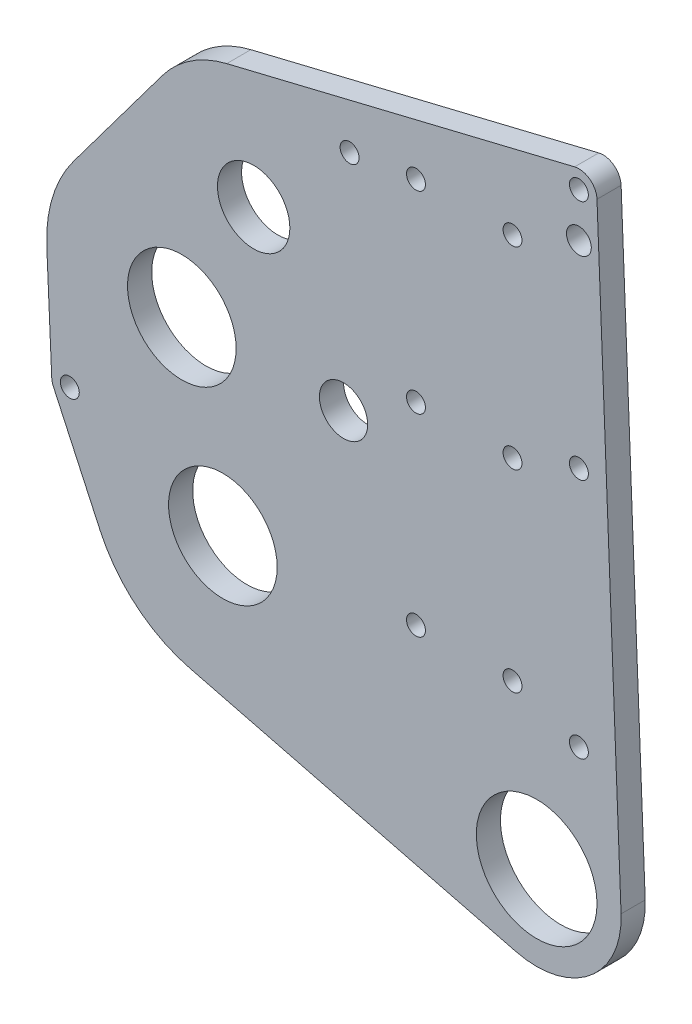
ISO-10303-21;
HEADER;
FILE_DESCRIPTION(('STEP AP214'),'2;1');
FILE_NAME('part.step','',(''),(''),'','','');
FILE_SCHEMA(('AUTOMOTIVE_DESIGN { 1 0 10303 214 1 1 1 1 }'));
ENDSEC;
DATA;
#1=APPLICATION_CONTEXT('core data for automotive mechanical design processes');
#2=APPLICATION_PROTOCOL_DEFINITION('international standard','automotive_design',2000,#1);
#3=PRODUCT_CONTEXT('',#1,'mechanical');
#4=PRODUCT('Part','Part','',(#3));
#5=PRODUCT_RELATED_PRODUCT_CATEGORY('part','',(#4));
#6=PRODUCT_DEFINITION_FORMATION('','',#4);
#7=PRODUCT_DEFINITION_CONTEXT('part definition',#1,'design');
#8=PRODUCT_DEFINITION('design','',#6,#7);
#9=PRODUCT_DEFINITION_SHAPE('','',#8);
#10=(LENGTH_UNIT() NAMED_UNIT(*) SI_UNIT(.MILLI.,.METRE.));
#11=(NAMED_UNIT(*) PLANE_ANGLE_UNIT() SI_UNIT($,.RADIAN.));
#12=(NAMED_UNIT(*) SI_UNIT($,.STERADIAN.) SOLID_ANGLE_UNIT());
#13=UNCERTAINTY_MEASURE_WITH_UNIT(LENGTH_MEASURE(1.E-05),#10,'distance_accuracy_value','');
#14=(GEOMETRIC_REPRESENTATION_CONTEXT(3) GLOBAL_UNCERTAINTY_ASSIGNED_CONTEXT((#13)) GLOBAL_UNIT_ASSIGNED_CONTEXT((#10,
#11,#12)) REPRESENTATION_CONTEXT('',''));
#15=CARTESIAN_POINT('',(0.,0.,0.));
#16=DIRECTION('',(0.,0.,1.));
#17=DIRECTION('',(1.,0.,0.));
#18=AXIS2_PLACEMENT_3D('',#15,#16,#17);
#19=CARTESIAN_POINT('',(-81.4649837073853,-3.60509332241219,6.35));
#20=DIRECTION('',(0.999022259122611,0.0442100189725756,0.));
#21=DIRECTION('',(-0.0442100189725756,0.999022259122611,0.));
#22=AXIS2_PLACEMENT_3D('',#19,#20,#21);
#23=PLANE('',#22);
#24=DIRECTION('',(0.0442100189725756,-0.999022259122611,0.));
#25=VECTOR('',#24,1.);
#26=CARTESIAN_POINT('',(-81.4649837073853,-3.60509332241219,0.));
#27=LINE('',#26,#25);
#28=CARTESIAN_POINT('',(-84.4202315344,63.1752073656032,0.));
#29=VERTEX_POINT('',#28);
#30=CARTESIAN_POINT('',(-83.1225405635379,33.8510361600236,0.));
#31=VERTEX_POINT('',#30);
#32=EDGE_CURVE('E240',#29,#31,#27,.T.);
#33=ORIENTED_EDGE('',*,*,#32,.T.);
#34=DIRECTION('',(0.,0.,-1.));
#35=VECTOR('',#34,1.);
#36=CARTESIAN_POINT('',(-83.1225405635379,33.8510361600236,6.35));
#37=LINE('',#36,#35);
#38=CARTESIAN_POINT('',(-83.1225405635379,33.8510361600236,6.35));
#39=VERTEX_POINT('',#38);
#40=EDGE_CURVE('E11',#39,#31,#37,.T.);
#41=ORIENTED_EDGE('',*,*,#40,.F.);
#42=DIRECTION('',(0.0442100189725756,-0.999022259122611,0.));
#43=VECTOR('',#42,1.);
#44=CARTESIAN_POINT('',(-81.4649837073853,-3.60509332241219,6.35));
#45=LINE('',#44,#43);
#46=CARTESIAN_POINT('',(-84.4202315344,63.1752073656032,6.35));
#47=VERTEX_POINT('',#46);
#48=EDGE_CURVE('E354',#47,#39,#45,.T.);
#49=ORIENTED_EDGE('',*,*,#48,.F.);
#50=DIRECTION('',(0.,0.,-1.));
#51=VECTOR('',#50,1.);
#52=CARTESIAN_POINT('',(-84.4202315344,63.1752073656032,6.35));
#53=LINE('',#52,#51);
#54=EDGE_CURVE('E168',#47,#29,#53,.T.);
#55=ORIENTED_EDGE('',*,*,#54,.T.);
#56=EDGE_LOOP('',(#33,#41,#49,#55));
#57=FACE_BOUND('',#56,.T.);
#58=ADVANCED_FACE('F47',(#57),#23,.F.);
#59=CARTESIAN_POINT('',(-78.3646970544664,34.0615863753805,6.35));
#60=DIRECTION('',(0.,0.,-1.));
#61=DIRECTION('',(-1.,0.,0.));
#62=AXIS2_PLACEMENT_3D('',#59,#60,#61);
#63=CYLINDRICAL_SURFACE('',#62,4.76250000000001);
#64=CARTESIAN_POINT('',(-78.3646970544664,34.0615863753805,0.));
#65=DIRECTION('',(0.,0.,1.));
#66=DIRECTION('',(1.,0.,0.));
#67=AXIS2_PLACEMENT_3D('',#64,#65,#66);
#68=CIRCLE('',#67,4.76250000000001);
#69=CARTESIAN_POINT('',(-82.6886710093196,32.0654261894858,0.));
#70=VERTEX_POINT('',#69);
#71=EDGE_CURVE('E244',#31,#70,#68,.T.);
#72=ORIENTED_EDGE('',*,*,#71,.T.);
#73=DIRECTION('',(0.,0.,-1.));
#74=VECTOR('',#73,1.);
#75=CARTESIAN_POINT('',(-82.6886710093196,32.0654261894858,6.35));
#76=LINE('',#75,#74);
#77=CARTESIAN_POINT('',(-82.6886710093196,32.0654261894858,6.35));
#78=VERTEX_POINT('',#77);
#79=EDGE_CURVE('E57',#78,#70,#76,.T.);
#80=ORIENTED_EDGE('',*,*,#79,.F.);
#81=CARTESIAN_POINT('',(-78.3646970544664,34.0615863753805,6.35));
#82=DIRECTION('',(0.,0.,1.));
#83=DIRECTION('',(1.,0.,0.));
#84=AXIS2_PLACEMENT_3D('',#81,#82,#83);
#85=CIRCLE('',#84,4.76250000000001);
#86=EDGE_CURVE('E120',#39,#78,#85,.T.);
#87=ORIENTED_EDGE('',*,*,#86,.F.);
#88=ORIENTED_EDGE('',*,*,#40,.T.);
#89=EDGE_LOOP('',(#72,#80,#87,#88));
#90=FACE_BOUND('',#89,.T.);
#91=ADVANCED_FACE('F369',(#90),#63,.T.);
#92=CARTESIAN_POINT('',(-55.9595694301041,-25.8337042920453,6.35));
#93=DIRECTION('',(0.907921040389125,0.419141246382087,0.));
#94=DIRECTION('',(-0.419141246382087,0.907921040389125,0.));
#95=AXIS2_PLACEMENT_3D('',#92,#93,#94);
#96=PLANE('',#95);
#97=DIRECTION('',(0.419141246382087,-0.907921040389125,0.));
#98=VECTOR('',#97,1.);
#99=CARTESIAN_POINT('',(-55.9595694301041,-25.8337042920453,0.));
#100=LINE('',#99,#98);
#101=CARTESIAN_POINT('',(-70.3856721962373,5.41533727865297,0.));
#102=VERTEX_POINT('',#101);
#103=EDGE_CURVE('E247',#70,#102,#100,.T.);
#104=ORIENTED_EDGE('',*,*,#103,.T.);
#105=DIRECTION('',(0.,0.,-1.));
#106=VECTOR('',#105,1.);
#107=CARTESIAN_POINT('',(-70.3856721962373,5.41533727865297,6.35));
#108=LINE('',#107,#106);
#109=CARTESIAN_POINT('',(-70.3856721962373,5.41533727865297,6.35));
#110=VERTEX_POINT('',#109);
#111=EDGE_CURVE('E302',#110,#102,#108,.T.);
#112=ORIENTED_EDGE('',*,*,#111,.F.);
#113=DIRECTION('',(0.419141246382087,-0.907921040389125,0.));
#114=VECTOR('',#113,1.);
#115=CARTESIAN_POINT('',(-55.9595694301041,-25.8337042920453,6.35));
#116=LINE('',#115,#114);
#117=EDGE_CURVE('E312',#78,#110,#116,.T.);
#118=ORIENTED_EDGE('',*,*,#117,.F.);
#119=ORIENTED_EDGE('',*,*,#79,.T.);
#120=EDGE_LOOP('',(#104,#112,#118,#119));
#121=FACE_BOUND('',#120,.T.);
#122=ADVANCED_FACE('F310',(#121),#96,.F.);
#123=CARTESIAN_POINT('',(-38.1,20.32,6.35));
#124=DIRECTION('',(0.,0.,-1.));
#125=DIRECTION('',(-1.,0.,0.));
#126=AXIS2_PLACEMENT_3D('',#123,#124,#125);
#127=CYLINDRICAL_SURFACE('',#126,35.56);
#128=CARTESIAN_POINT('',(-38.1,20.32,0.));
#129=DIRECTION('',(0.,0.,1.));
#130=DIRECTION('',(1.,0.,0.));
#131=AXIS2_PLACEMENT_3D('',#128,#129,#130);
#132=CIRCLE('',#131,35.56);
#133=CARTESIAN_POINT('',(-46.8094811901803,-14.1569276096043,0.));
#134=VERTEX_POINT('',#133);
#135=EDGE_CURVE('E250',#102,#134,#132,.T.);
#136=ORIENTED_EDGE('',*,*,#135,.T.);
#137=DIRECTION('',(0.,0.,-1.));
#138=VECTOR('',#137,1.);
#139=CARTESIAN_POINT('',(-46.8094811901803,-14.1569276096043,6.35));
#140=LINE('',#139,#138);
#141=CARTESIAN_POINT('',(-46.8094811901803,-14.1569276096043,6.35));
#142=VERTEX_POINT('',#141);
#143=EDGE_CURVE('E298',#142,#134,#140,.T.);
#144=ORIENTED_EDGE('',*,*,#143,.F.);
#145=CARTESIAN_POINT('',(-38.1,20.32,6.35));
#146=DIRECTION('',(0.,0.,1.));
#147=DIRECTION('',(1.,0.,0.));
#148=AXIS2_PLACEMENT_3D('',#145,#146,#147);
#149=CIRCLE('',#148,35.56);
#150=EDGE_CURVE('E331',#110,#142,#149,.T.);
#151=ORIENTED_EDGE('',*,*,#150,.F.);
#152=ORIENTED_EDGE('',*,*,#111,.T.);
#153=EDGE_LOOP('',(#136,#144,#151,#152));
#154=FACE_BOUND('',#153,.T.);
#155=ADVANCED_FACE('F321',(#154),#127,.T.);
#156=CARTESIAN_POINT('',(-6.1697429589074,-24.423243671959,6.35));
#157=DIRECTION('',(0.244923543030941,0.969542396220594,0.));
#158=DIRECTION('',(-0.969542396220594,0.244923543030941,0.));
#159=AXIS2_PLACEMENT_3D('',#156,#157,#158);
#160=PLANE('',#159);
#161=DIRECTION('',(0.969542396220594,-0.244923543030941,0.));
#162=VECTOR('',#161,1.);
#163=CARTESIAN_POINT('',(-6.1697429589074,-24.423243671959,0.));
#164=LINE('',#163,#162);
#165=CARTESIAN_POINT('',(39.0065742561373,-35.8355797560027,0.));
#166=VERTEX_POINT('',#165);
#167=EDGE_CURVE('E253',#134,#166,#164,.T.);
#168=ORIENTED_EDGE('',*,*,#167,.T.);
#169=DIRECTION('',(0.,0.,-1.));
#170=VECTOR('',#169,1.);
#171=CARTESIAN_POINT('',(39.0065742561373,-35.8355797560027,6.35));
#172=LINE('',#171,#170);
#173=CARTESIAN_POINT('',(39.0065742561373,-35.8355797560027,6.35));
#174=VERTEX_POINT('',#173);
#175=EDGE_CURVE('E294',#174,#166,#172,.T.);
#176=ORIENTED_EDGE('',*,*,#175,.F.);
#177=DIRECTION('',(0.969542396220594,-0.244923543030941,0.));
#178=VECTOR('',#177,1.);
#179=CARTESIAN_POINT('',(-6.1697429589074,-24.423243671959,6.35));
#180=LINE('',#179,#178);
#181=EDGE_CURVE('E327',#142,#174,#180,.T.);
#182=ORIENTED_EDGE('',*,*,#181,.F.);
#183=ORIENTED_EDGE('',*,*,#143,.T.);
#184=EDGE_LOOP('',(#168,#176,#182,#183));
#185=FACE_BOUND('',#184,.T.);
#186=ADVANCED_FACE('F325',(#185),#160,.F.);
#187=CARTESIAN_POINT('',(44.45,-14.2875,6.35));
#188=DIRECTION('',(0.,0.,-1.));
#189=DIRECTION('',(-1.,0.,0.));
#190=AXIS2_PLACEMENT_3D('',#187,#188,#189);
#191=CYLINDRICAL_SURFACE('',#190,22.225);
#192=CARTESIAN_POINT('',(44.45,-14.2875,0.));
#193=DIRECTION('',(0.,0.,1.));
#194=DIRECTION('',(1.,0.,0.));
#195=AXIS2_PLACEMENT_3D('',#192,#193,#194);
#196=CIRCLE('',#195,22.225);
#197=CARTESIAN_POINT('',(66.6575154334442,-13.4060901785567,0.));
#198=VERTEX_POINT('',#197);
#199=EDGE_CURVE('E256',#166,#198,#196,.T.);
#200=ORIENTED_EDGE('',*,*,#199,.T.);
#201=DIRECTION('',(0.,0.,-1.));
#202=VECTOR('',#201,1.);
#203=CARTESIAN_POINT('',(66.6575154334442,-13.4060901785567,6.35));
#204=LINE('',#203,#202);
#205=CARTESIAN_POINT('',(66.6575154334442,-13.4060901785567,6.35));
#206=VERTEX_POINT('',#205);
#207=EDGE_CURVE('E291',#206,#198,#204,.T.);
#208=ORIENTED_EDGE('',*,*,#207,.F.);
#209=CARTESIAN_POINT('',(44.45,-14.2875,6.35));
#210=DIRECTION('',(0.,0.,1.));
#211=DIRECTION('',(1.,0.,0.));
#212=AXIS2_PLACEMENT_3D('',#209,#210,#211);
#213=CIRCLE('',#212,22.225);
#214=EDGE_CURVE('E330',#174,#206,#213,.T.);
#215=ORIENTED_EDGE('',*,*,#214,.F.);
#216=ORIENTED_EDGE('',*,*,#175,.T.);
#217=EDGE_LOOP('',(#200,#208,#215,#216));
#218=FACE_BOUND('',#217,.T.);
#219=ADVANCED_FACE('F650',(#218),#191,.T.);
#220=CARTESIAN_POINT('',(66.0214298426699,2.62037132715079,6.35));
#221=DIRECTION('',(0.999213292843385,0.0396584846543646,0.));
#222=DIRECTION('',(-0.0396584846543647,0.999213292843385,0.));
#223=AXIS2_PLACEMENT_3D('',#220,#221,#222);
#224=PLANE('',#223);
#225=DIRECTION('',(0.0396584846543647,-0.999213292843385,0.));
#226=VECTOR('',#225,1.);
#227=CARTESIAN_POINT('',(66.0214298426699,2.62037132715079,0.));
#228=LINE('',#227,#226);
#229=CARTESIAN_POINT('',(60.3212533071744,146.238873533191,0.));
#230=VERTEX_POINT('',#229);
#231=EDGE_CURVE('E260',#230,#198,#228,.T.);
#232=ORIENTED_EDGE('',*,*,#231,.F.);
#233=DIRECTION('',(0.,0.,-1.));
#234=VECTOR('',#233,1.);
#235=CARTESIAN_POINT('',(60.3212533071744,146.238873533191,6.35));
#236=LINE('',#235,#234);
#237=CARTESIAN_POINT('',(60.3212533071744,146.238873533191,6.35));
#238=VERTEX_POINT('',#237);
#239=EDGE_CURVE('E288',#238,#230,#236,.T.);
#240=ORIENTED_EDGE('',*,*,#239,.F.);
#241=DIRECTION('',(0.0396584846543647,-0.999213292843385,0.));
#242=VECTOR('',#241,1.);
#243=CARTESIAN_POINT('',(66.0214298426699,2.62037132715079,6.35));
#244=LINE('',#243,#242);
#245=EDGE_CURVE('E335',#238,#206,#244,.T.);
#246=ORIENTED_EDGE('',*,*,#245,.T.);
#247=ORIENTED_EDGE('',*,*,#207,.T.);
#248=EDGE_LOOP('',(#232,#240,#246,#247));
#249=FACE_BOUND('',#248,.T.);
#250=ADVANCED_FACE('F640',(#249),#224,.T.);
#251=CARTESIAN_POINT('',(55.5625000000077,146.050000000024,6.35));
#252=DIRECTION('',(0.,0.,-1.));
#253=DIRECTION('',(-1.,0.,0.));
#254=AXIS2_PLACEMENT_3D('',#251,#252,#253);
#255=CYLINDRICAL_SURFACE('',#254,4.76250000000002);
#256=CARTESIAN_POINT('',(55.5625000000077,146.050000000024,0.));
#257=DIRECTION('',(0.,0.,1.));
#258=DIRECTION('',(1.,0.,0.));
#259=AXIS2_PLACEMENT_3D('',#256,#257,#258);
#260=CIRCLE('',#259,4.76250000000002);
#261=CARTESIAN_POINT('',(54.4379586815956,150.677830277075,0.));
#262=VERTEX_POINT('',#261);
#263=EDGE_CURVE('E264',#230,#262,#260,.T.);
#264=ORIENTED_EDGE('',*,*,#263,.T.);
#265=DIRECTION('',(0.,0.,-1.));
#266=VECTOR('',#265,1.);
#267=CARTESIAN_POINT('',(54.4379586815956,150.677830277075,6.35));
#268=LINE('',#267,#266);
#269=CARTESIAN_POINT('',(54.4379586815956,150.677830277075,6.35));
#270=VERTEX_POINT('',#269);
#271=EDGE_CURVE('E285',#270,#262,#268,.T.);
#272=ORIENTED_EDGE('',*,*,#271,.F.);
#273=CARTESIAN_POINT('',(55.5625000000077,146.050000000024,6.35));
#274=DIRECTION('',(0.,0.,1.));
#275=DIRECTION('',(1.,0.,0.));
#276=AXIS2_PLACEMENT_3D('',#273,#274,#275);
#277=CIRCLE('',#276,4.76250000000002);
#278=EDGE_CURVE('E343',#238,#270,#277,.T.);
#279=ORIENTED_EDGE('',*,*,#278,.F.);
#280=ORIENTED_EDGE('',*,*,#239,.T.);
#281=EDGE_LOOP('',(#264,#272,#279,#280));
#282=FACE_BOUND('',#281,.T.);
#283=ADVANCED_FACE('F631',(#282),#255,.T.);
#284=CARTESIAN_POINT('',(-31.5374465878124,129.786205086727,6.35));
#285=DIRECTION('',(-0.23612416134638,0.971722892818971,0.));
#286=DIRECTION('',(-0.971722892818971,-0.23612416134638,0.));
#287=AXIS2_PLACEMENT_3D('',#284,#285,#286);
#288=PLANE('',#287);
#289=DIRECTION('',(0.971722892818971,0.23612416134638,0.));
#290=VECTOR('',#289,1.);
#291=CARTESIAN_POINT('',(-31.5374465878124,129.786205086727,0.));
#292=LINE('',#291,#290);
#293=CARTESIAN_POINT('',(-37.0837247711685,128.43848518189,0.));
#294=VERTEX_POINT('',#293);
#295=EDGE_CURVE('E268',#294,#262,#292,.T.);
#296=ORIENTED_EDGE('',*,*,#295,.F.);
#297=DIRECTION('',(0.,0.,-1.));
#298=VECTOR('',#297,1.);
#299=CARTESIAN_POINT('',(-37.0837247711685,128.43848518189,6.35));
#300=LINE('',#299,#298);
#301=CARTESIAN_POINT('',(-37.0837247711685,128.43848518189,6.35));
#302=VERTEX_POINT('',#301);
#303=EDGE_CURVE('E161',#302,#294,#300,.T.);
#304=ORIENTED_EDGE('',*,*,#303,.F.);
#305=DIRECTION('',(0.971722892818971,0.23612416134638,0.));
#306=VECTOR('',#305,1.);
#307=CARTESIAN_POINT('',(-31.5374465878124,129.786205086727,6.35));
#308=LINE('',#307,#306);
#309=EDGE_CURVE('E152',#302,#270,#308,.T.);
#310=ORIENTED_EDGE('',*,*,#309,.T.);
#311=ORIENTED_EDGE('',*,*,#271,.T.);
#312=EDGE_LOOP('',(#296,#304,#310,#311));
#313=FACE_BOUND('',#312,.T.);
#314=ADVANCED_FACE('F348',(#313),#288,.T.);
#315=CARTESIAN_POINT('',(-29.999999944,99.286798451737,6.35));
#316=DIRECTION('',(0.,0.,-1.));
#317=DIRECTION('',(-1.,0.,0.));
#318=AXIS2_PLACEMENT_3D('',#315,#316,#317);
#319=CYLINDRICAL_SURFACE('',#318,29.999999944);
#320=CARTESIAN_POINT('',(-29.999999944,99.286798451737,0.));
#321=DIRECTION('',(0.,0.,1.));
#322=DIRECTION('',(1.,0.,0.));
#323=AXIS2_PLACEMENT_3D('',#320,#321,#322);
#324=CIRCLE('',#323,29.999999944);
#325=CARTESIAN_POINT('',(-54.0220083124324,117.257416431845,0.));
#326=VERTEX_POINT('',#325);
#327=EDGE_CURVE('E159',#294,#326,#324,.T.);
#328=ORIENTED_EDGE('',*,*,#327,.T.);
#329=DIRECTION('',(0.,0.,-1.));
#330=VECTOR('',#329,1.);
#331=CARTESIAN_POINT('',(-54.0220083124324,117.257416431845,6.35));
#332=LINE('',#331,#330);
#333=CARTESIAN_POINT('',(-54.0220083124324,117.257416431845,6.35));
#334=VERTEX_POINT('',#333);
#335=EDGE_CURVE('E156',#334,#326,#332,.T.);
#336=ORIENTED_EDGE('',*,*,#335,.F.);
#337=CARTESIAN_POINT('',(-29.999999944,99.286798451737,6.35));
#338=DIRECTION('',(0.,0.,1.));
#339=DIRECTION('',(1.,0.,0.));
#340=AXIS2_PLACEMENT_3D('',#337,#338,#339);
#341=CIRCLE('',#340,29.999999944);
#342=EDGE_CURVE('E146',#302,#334,#341,.T.);
#343=ORIENTED_EDGE('',*,*,#342,.F.);
#344=ORIENTED_EDGE('',*,*,#303,.T.);
#345=EDGE_LOOP('',(#328,#336,#343,#344));
#346=FACE_BOUND('',#345,.T.);
#347=ADVANCED_FACE('F157',(#346),#319,.T.);
#348=CARTESIAN_POINT('',(-90.8807396002924,67.9869488036928,6.35));
#349=DIRECTION('',(0.800733613775781,-0.599020600455091,0.));
#350=DIRECTION('',(0.599020600455091,0.800733613775781,0.));
#351=AXIS2_PLACEMENT_3D('',#348,#349,#350);
#352=PLANE('',#351);
#353=DIRECTION('',(-0.599020600455091,-0.800733613775781,0.));
#354=VECTOR('',#353,1.);
#355=CARTESIAN_POINT('',(-90.8807396002924,67.9869488036928,0.));
#356=LINE('',#355,#354);
#357=CARTESIAN_POINT('',(-77.3690873058668,86.048488192451,0.));
#358=VERTEX_POINT('',#357);
#359=EDGE_CURVE('E106',#326,#358,#356,.T.);
#360=ORIENTED_EDGE('',*,*,#359,.T.);
#361=DIRECTION('',(0.,0.,-1.));
#362=VECTOR('',#361,1.);
#363=CARTESIAN_POINT('',(-77.3690873058668,86.048488192451,6.35));
#364=LINE('',#363,#362);
#365=CARTESIAN_POINT('',(-77.3690873058668,86.048488192451,6.35));
#366=VERTEX_POINT('',#365);
#367=EDGE_CURVE('E162',#366,#358,#364,.T.);
#368=ORIENTED_EDGE('',*,*,#367,.F.);
#369=DIRECTION('',(-0.599020600455091,-0.800733613775781,0.));
#370=VECTOR('',#369,1.);
#371=CARTESIAN_POINT('',(-90.8807396002924,67.9869488036928,6.35));
#372=LINE('',#371,#370);
#373=EDGE_CURVE('E150',#334,#366,#372,.T.);
#374=ORIENTED_EDGE('',*,*,#373,.F.);
#375=ORIENTED_EDGE('',*,*,#335,.T.);
#376=EDGE_LOOP('',(#360,#368,#374,#375));
#377=FACE_BOUND('',#376,.T.);
#378=ADVANCED_FACE('F164',(#377),#352,.F.);
#379=CARTESIAN_POINT('',(44.45,-14.2875,6.35));
#380=DIRECTION('',(0.,0.,-1.));
#381=DIRECTION('',(-1.,0.,0.));
#382=AXIS2_PLACEMENT_3D('',#379,#380,#381);
#383=CYLINDRICAL_SURFACE('',#382,15.875);
#384=CARTESIAN_POINT('',(44.45,-14.2875,6.35));
#385=DIRECTION('',(0.,0.,1.));
#386=DIRECTION('',(1.,0.,0.));
#387=AXIS2_PLACEMENT_3D('',#384,#385,#386);
#388=CIRCLE('',#387,15.875);
#389=CARTESIAN_POINT('',(60.325,-14.2875,6.35));
#390=VERTEX_POINT('',#389);
#391=EDGE_CURVE('E764',#390,#390,#388,.T.);
#392=ORIENTED_EDGE('',*,*,#391,.T.);
#393=EDGE_LOOP('',(#392));
#394=FACE_BOUND('',#393,.T.);
#395=CARTESIAN_POINT('',(44.45,-14.2875,0.));
#396=DIRECTION('',(0.,0.,1.));
#397=DIRECTION('',(1.,0.,0.));
#398=AXIS2_PLACEMENT_3D('',#395,#396,#397);
#399=CIRCLE('',#398,15.875);
#400=CARTESIAN_POINT('',(60.325,-14.2875,0.));
#401=VERTEX_POINT('',#400);
#402=EDGE_CURVE('E236',#401,#401,#399,.T.);
#403=ORIENTED_EDGE('',*,*,#402,.F.);
#404=EDGE_LOOP('',(#403));
#405=FACE_BOUND('',#404,.T.);
#406=ADVANCED_FACE('F377',(#394,#405),#383,.F.);
#407=CARTESIAN_POINT('',(-29.999999944,99.286798451737,6.35));
#408=DIRECTION('',(0.,0.,-1.));
#409=DIRECTION('',(-1.,0.,0.));
#410=AXIS2_PLACEMENT_3D('',#407,#408,#409);
#411=CYLINDRICAL_SURFACE('',#410,9.52500000000001);
#412=CARTESIAN_POINT('',(-29.999999944,99.286798451737,6.35));
#413=DIRECTION('',(0.,0.,1.));
#414=DIRECTION('',(1.,0.,0.));
#415=AXIS2_PLACEMENT_3D('',#412,#413,#414);
#416=CIRCLE('',#415,9.52500000000001);
#417=CARTESIAN_POINT('',(-20.474999944,99.286798451737,6.35));
#418=VERTEX_POINT('',#417);
#419=EDGE_CURVE('E760',#418,#418,#416,.T.);
#420=ORIENTED_EDGE('',*,*,#419,.T.);
#421=EDGE_LOOP('',(#420));
#422=FACE_BOUND('',#421,.T.);
#423=CARTESIAN_POINT('',(-29.999999944,99.286798451737,0.));
#424=DIRECTION('',(0.,0.,1.));
#425=DIRECTION('',(1.,0.,0.));
#426=AXIS2_PLACEMENT_3D('',#423,#424,#425);
#427=CIRCLE('',#426,9.52500000000001);
#428=CARTESIAN_POINT('',(-20.474999944,99.286798451737,0.));
#429=VERTEX_POINT('',#428);
#430=EDGE_CURVE('E232',#429,#429,#427,.T.);
#431=ORIENTED_EDGE('',*,*,#430,.F.);
#432=EDGE_LOOP('',(#431));
#433=FACE_BOUND('',#432,.T.);
#434=ADVANCED_FACE('F380',(#422,#433),#411,.F.);
#435=CARTESIAN_POINT('',(12.7,127.,6.35));
#436=DIRECTION('',(0.,0.,-1.));
#437=DIRECTION('',(-1.,0.,0.));
#438=AXIS2_PLACEMENT_3D('',#435,#436,#437);
#439=CYLINDRICAL_SURFACE('',#438,2.48920000000001);
#440=CARTESIAN_POINT('',(12.7,127.,6.35));
#441=DIRECTION('',(0.,0.,1.));
#442=DIRECTION('',(1.,0.,0.));
#443=AXIS2_PLACEMENT_3D('',#440,#441,#442);
#444=CIRCLE('',#443,2.48920000000001);
#445=CARTESIAN_POINT('',(15.1892,127.,6.35));
#446=VERTEX_POINT('',#445);
#447=EDGE_CURVE('E756',#446,#446,#444,.T.);
#448=ORIENTED_EDGE('',*,*,#447,.T.);
#449=EDGE_LOOP('',(#448));
#450=FACE_BOUND('',#449,.T.);
#451=CARTESIAN_POINT('',(12.7,127.,0.));
#452=DIRECTION('',(0.,0.,1.));
#453=DIRECTION('',(1.,0.,0.));
#454=AXIS2_PLACEMENT_3D('',#451,#452,#453);
#455=CIRCLE('',#454,2.48920000000001);
#456=CARTESIAN_POINT('',(15.1892,127.,0.));
#457=VERTEX_POINT('',#456);
#458=EDGE_CURVE('E228',#457,#457,#455,.T.);
#459=ORIENTED_EDGE('',*,*,#458,.F.);
#460=EDGE_LOOP('',(#459));
#461=FACE_BOUND('',#460,.T.);
#462=ADVANCED_FACE('F384',(#450,#461),#439,.F.);
#463=CARTESIAN_POINT('',(38.1,127.,6.35));
#464=DIRECTION('',(0.,0.,-1.));
#465=DIRECTION('',(-1.,0.,0.));
#466=AXIS2_PLACEMENT_3D('',#463,#464,#465);
#467=CYLINDRICAL_SURFACE('',#466,2.48919999999997);
#468=CARTESIAN_POINT('',(38.1,127.,6.35));
#469=DIRECTION('',(0.,0.,1.));
#470=DIRECTION('',(1.,0.,0.));
#471=AXIS2_PLACEMENT_3D('',#468,#469,#470);
#472=CIRCLE('',#471,2.48919999999997);
#473=CARTESIAN_POINT('',(40.5892,127.,6.35));
#474=VERTEX_POINT('',#473);
#475=EDGE_CURVE('E752',#474,#474,#472,.T.);
#476=ORIENTED_EDGE('',*,*,#475,.T.);
#477=EDGE_LOOP('',(#476));
#478=FACE_BOUND('',#477,.T.);
#479=CARTESIAN_POINT('',(38.1,127.,0.));
#480=DIRECTION('',(0.,0.,1.));
#481=DIRECTION('',(1.,0.,0.));
#482=AXIS2_PLACEMENT_3D('',#479,#480,#481);
#483=CIRCLE('',#482,2.48919999999997);
#484=CARTESIAN_POINT('',(40.5892,127.,0.));
#485=VERTEX_POINT('',#484);
#486=EDGE_CURVE('E224',#485,#485,#483,.T.);
#487=ORIENTED_EDGE('',*,*,#486,.F.);
#488=EDGE_LOOP('',(#487));
#489=FACE_BOUND('',#488,.T.);
#490=ADVANCED_FACE('F388',(#478,#489),#467,.F.);
#491=CARTESIAN_POINT('',(38.1,76.2,6.35));
#492=DIRECTION('',(0.,0.,-1.));
#493=DIRECTION('',(-1.,0.,0.));
#494=AXIS2_PLACEMENT_3D('',#491,#492,#493);
#495=CYLINDRICAL_SURFACE('',#494,2.48919999999999);
#496=CARTESIAN_POINT('',(38.1,76.2,6.35));
#497=DIRECTION('',(0.,0.,1.));
#498=DIRECTION('',(1.,0.,0.));
#499=AXIS2_PLACEMENT_3D('',#496,#497,#498);
#500=CIRCLE('',#499,2.48919999999999);
#501=CARTESIAN_POINT('',(40.5892,76.2,6.35));
#502=VERTEX_POINT('',#501);
#503=EDGE_CURVE('E748',#502,#502,#500,.T.);
#504=ORIENTED_EDGE('',*,*,#503,.T.);
#505=EDGE_LOOP('',(#504));
#506=FACE_BOUND('',#505,.T.);
#507=CARTESIAN_POINT('',(38.1,76.2,0.));
#508=DIRECTION('',(0.,0.,1.));
#509=DIRECTION('',(1.,0.,0.));
#510=AXIS2_PLACEMENT_3D('',#507,#508,#509);
#511=CIRCLE('',#510,2.48919999999999);
#512=CARTESIAN_POINT('',(40.5892,76.2,0.));
#513=VERTEX_POINT('',#512);
#514=EDGE_CURVE('E220',#513,#513,#511,.T.);
#515=ORIENTED_EDGE('',*,*,#514,.F.);
#516=EDGE_LOOP('',(#515));
#517=FACE_BOUND('',#516,.T.);
#518=ADVANCED_FACE('F392',(#506,#517),#495,.F.);
#519=CARTESIAN_POINT('',(38.1,25.4,6.35));
#520=DIRECTION('',(0.,0.,-1.));
#521=DIRECTION('',(-1.,0.,0.));
#522=AXIS2_PLACEMENT_3D('',#519,#520,#521);
#523=CYLINDRICAL_SURFACE('',#522,2.4892);
#524=CARTESIAN_POINT('',(38.1,25.4,6.35));
#525=DIRECTION('',(0.,0.,1.));
#526=DIRECTION('',(1.,0.,0.));
#527=AXIS2_PLACEMENT_3D('',#524,#525,#526);
#528=CIRCLE('',#527,2.4892);
#529=CARTESIAN_POINT('',(40.5892,25.4,6.35));
#530=VERTEX_POINT('',#529);
#531=EDGE_CURVE('E744',#530,#530,#528,.T.);
#532=ORIENTED_EDGE('',*,*,#531,.T.);
#533=EDGE_LOOP('',(#532));
#534=FACE_BOUND('',#533,.T.);
#535=CARTESIAN_POINT('',(38.1,25.4,0.));
#536=DIRECTION('',(0.,0.,1.));
#537=DIRECTION('',(1.,0.,0.));
#538=AXIS2_PLACEMENT_3D('',#535,#536,#537);
#539=CIRCLE('',#538,2.4892);
#540=CARTESIAN_POINT('',(40.5892,25.4,0.));
#541=VERTEX_POINT('',#540);
#542=EDGE_CURVE('E216',#541,#541,#539,.T.);
#543=ORIENTED_EDGE('',*,*,#542,.F.);
#544=EDGE_LOOP('',(#543));
#545=FACE_BOUND('',#544,.T.);
#546=ADVANCED_FACE('F396',(#534,#545),#523,.F.);
#547=CARTESIAN_POINT('',(12.7,25.4,6.35));
#548=DIRECTION('',(0.,0.,-1.));
#549=DIRECTION('',(-1.,0.,0.));
#550=AXIS2_PLACEMENT_3D('',#547,#548,#549);
#551=CYLINDRICAL_SURFACE('',#550,2.4892);
#552=CARTESIAN_POINT('',(12.7,25.4,6.35));
#553=DIRECTION('',(0.,0.,1.));
#554=DIRECTION('',(1.,0.,0.));
#555=AXIS2_PLACEMENT_3D('',#552,#553,#554);
#556=CIRCLE('',#555,2.4892);
#557=CARTESIAN_POINT('',(15.1892,25.4,6.35));
#558=VERTEX_POINT('',#557);
#559=EDGE_CURVE('E740',#558,#558,#556,.T.);
#560=ORIENTED_EDGE('',*,*,#559,.T.);
#561=EDGE_LOOP('',(#560));
#562=FACE_BOUND('',#561,.T.);
#563=CARTESIAN_POINT('',(12.7,25.4,0.));
#564=DIRECTION('',(0.,0.,1.));
#565=DIRECTION('',(1.,0.,0.));
#566=AXIS2_PLACEMENT_3D('',#563,#564,#565);
#567=CIRCLE('',#566,2.4892);
#568=CARTESIAN_POINT('',(15.1892,25.4,0.));
#569=VERTEX_POINT('',#568);
#570=EDGE_CURVE('E212',#569,#569,#567,.T.);
#571=ORIENTED_EDGE('',*,*,#570,.F.);
#572=EDGE_LOOP('',(#571));
#573=FACE_BOUND('',#572,.T.);
#574=ADVANCED_FACE('F400',(#562,#573),#551,.F.);
#575=CARTESIAN_POINT('',(12.7,76.2,6.35));
#576=DIRECTION('',(0.,0.,-1.));
#577=DIRECTION('',(-1.,0.,0.));
#578=AXIS2_PLACEMENT_3D('',#575,#576,#577);
#579=CYLINDRICAL_SURFACE('',#578,2.48919999999999);
#580=CARTESIAN_POINT('',(12.7,76.2,6.35));
#581=DIRECTION('',(0.,0.,1.));
#582=DIRECTION('',(1.,0.,0.));
#583=AXIS2_PLACEMENT_3D('',#580,#581,#582);
#584=CIRCLE('',#583,2.48919999999999);
#585=CARTESIAN_POINT('',(15.1892,76.2,6.35));
#586=VERTEX_POINT('',#585);
#587=EDGE_CURVE('E736',#586,#586,#584,.T.);
#588=ORIENTED_EDGE('',*,*,#587,.T.);
#589=EDGE_LOOP('',(#588));
#590=FACE_BOUND('',#589,.T.);
#591=CARTESIAN_POINT('',(12.7,76.2,0.));
#592=DIRECTION('',(0.,0.,1.));
#593=DIRECTION('',(1.,0.,0.));
#594=AXIS2_PLACEMENT_3D('',#591,#592,#593);
#595=CIRCLE('',#594,2.48919999999999);
#596=CARTESIAN_POINT('',(15.1892,76.2,0.));
#597=VERTEX_POINT('',#596);
#598=EDGE_CURVE('E208',#597,#597,#595,.T.);
#599=ORIENTED_EDGE('',*,*,#598,.F.);
#600=EDGE_LOOP('',(#599));
#601=FACE_BOUND('',#600,.T.);
#602=ADVANCED_FACE('F404',(#590,#601),#579,.F.);
#603=CARTESIAN_POINT('',(-38.1,20.32,6.35));
#604=DIRECTION('',(0.,0.,-1.));
#605=DIRECTION('',(-1.,0.,0.));
#606=AXIS2_PLACEMENT_3D('',#603,#604,#605);
#607=CYLINDRICAL_SURFACE('',#606,14.2875);
#608=CARTESIAN_POINT('',(-38.1,20.32,6.35));
#609=DIRECTION('',(0.,0.,1.));
#610=DIRECTION('',(1.,0.,0.));
#611=AXIS2_PLACEMENT_3D('',#608,#609,#610);
#612=CIRCLE('',#611,14.2875);
#613=CARTESIAN_POINT('',(-23.8125,20.32,6.35));
#614=VERTEX_POINT('',#613);
#615=EDGE_CURVE('E732',#614,#614,#612,.T.);
#616=ORIENTED_EDGE('',*,*,#615,.T.);
#617=EDGE_LOOP('',(#616));
#618=FACE_BOUND('',#617,.T.);
#619=CARTESIAN_POINT('',(-38.1,20.32,0.));
#620=DIRECTION('',(0.,0.,1.));
#621=DIRECTION('',(1.,0.,0.));
#622=AXIS2_PLACEMENT_3D('',#619,#620,#621);
#623=CIRCLE('',#622,14.2875);
#624=CARTESIAN_POINT('',(-23.8125,20.32,0.));
#625=VERTEX_POINT('',#624);
#626=EDGE_CURVE('E204',#625,#625,#623,.T.);
#627=ORIENTED_EDGE('',*,*,#626,.F.);
#628=EDGE_LOOP('',(#627));
#629=FACE_BOUND('',#628,.T.);
#630=ADVANCED_FACE('F408',(#618,#629),#607,.F.);
#631=CARTESIAN_POINT('',(-48.895,64.747315640268,6.35));
#632=DIRECTION('',(0.,0.,-1.));
#633=DIRECTION('',(-1.,0.,0.));
#634=AXIS2_PLACEMENT_3D('',#631,#632,#633);
#635=CYLINDRICAL_SURFACE('',#634,14.2875);
#636=CARTESIAN_POINT('',(-48.895,64.747315640268,6.35));
#637=DIRECTION('',(0.,0.,1.));
#638=DIRECTION('',(1.,0.,0.));
#639=AXIS2_PLACEMENT_3D('',#636,#637,#638);
#640=CIRCLE('',#639,14.2875);
#641=CARTESIAN_POINT('',(-34.6075,64.747315640268,6.35));
#642=VERTEX_POINT('',#641);
#643=EDGE_CURVE('E728',#642,#642,#640,.T.);
#644=ORIENTED_EDGE('',*,*,#643,.T.);
#645=EDGE_LOOP('',(#644));
#646=FACE_BOUND('',#645,.T.);
#647=CARTESIAN_POINT('',(-48.895,64.747315640268,0.));
#648=DIRECTION('',(0.,0.,1.));
#649=DIRECTION('',(1.,0.,0.));
#650=AXIS2_PLACEMENT_3D('',#647,#648,#649);
#651=CIRCLE('',#650,14.2875);
#652=CARTESIAN_POINT('',(-34.6075,64.747315640268,0.));
#653=VERTEX_POINT('',#652);
#654=EDGE_CURVE('E200',#653,#653,#651,.T.);
#655=ORIENTED_EDGE('',*,*,#654,.F.);
#656=EDGE_LOOP('',(#655));
#657=FACE_BOUND('',#656,.T.);
#658=ADVANCED_FACE('F412',(#646,#657),#635,.F.);
#659=CARTESIAN_POINT('',(-4.7625,124.338389151263,6.35));
#660=DIRECTION('',(0.,0.,-1.));
#661=DIRECTION('',(-1.,0.,0.));
#662=AXIS2_PLACEMENT_3D('',#659,#660,#661);
#663=CYLINDRICAL_SURFACE('',#662,2.48920000000001);
#664=CARTESIAN_POINT('',(-4.7625,124.338389151263,6.35));
#665=DIRECTION('',(0.,0.,1.));
#666=DIRECTION('',(1.,0.,0.));
#667=AXIS2_PLACEMENT_3D('',#664,#665,#666);
#668=CIRCLE('',#667,2.48920000000001);
#669=CARTESIAN_POINT('',(-2.27329999999999,124.338389151263,6.35));
#670=VERTEX_POINT('',#669);
#671=EDGE_CURVE('E724',#670,#670,#668,.T.);
#672=ORIENTED_EDGE('',*,*,#671,.T.);
#673=EDGE_LOOP('',(#672));
#674=FACE_BOUND('',#673,.T.);
#675=CARTESIAN_POINT('',(-4.7625,124.338389151263,0.));
#676=DIRECTION('',(0.,0.,1.));
#677=DIRECTION('',(1.,0.,0.));
#678=AXIS2_PLACEMENT_3D('',#675,#676,#677);
#679=CIRCLE('',#678,2.48920000000001);
#680=CARTESIAN_POINT('',(-2.27329999999999,124.338389151263,0.));
#681=VERTEX_POINT('',#680);
#682=EDGE_CURVE('E196',#681,#681,#679,.T.);
#683=ORIENTED_EDGE('',*,*,#682,.F.);
#684=EDGE_LOOP('',(#683));
#685=FACE_BOUND('',#684,.T.);
#686=ADVANCED_FACE('F416',(#674,#685),#663,.F.);
#687=CARTESIAN_POINT('',(55.5625000000077,146.050000000024,6.35));
#688=DIRECTION('',(0.,0.,-1.));
#689=DIRECTION('',(-1.,0.,0.));
#690=AXIS2_PLACEMENT_3D('',#687,#688,#689);
#691=CYLINDRICAL_SURFACE('',#690,2.4892);
#692=CARTESIAN_POINT('',(55.5625000000077,146.050000000024,6.35));
#693=DIRECTION('',(0.,0.,1.));
#694=DIRECTION('',(1.,0.,0.));
#695=AXIS2_PLACEMENT_3D('',#692,#693,#694);
#696=CIRCLE('',#695,2.4892);
#697=CARTESIAN_POINT('',(58.0517000000077,146.050000000024,6.35));
#698=VERTEX_POINT('',#697);
#699=EDGE_CURVE('E720',#698,#698,#696,.T.);
#700=ORIENTED_EDGE('',*,*,#699,.T.);
#701=EDGE_LOOP('',(#700));
#702=FACE_BOUND('',#701,.T.);
#703=CARTESIAN_POINT('',(55.5625000000077,146.050000000024,0.));
#704=DIRECTION('',(0.,0.,1.));
#705=DIRECTION('',(1.,0.,0.));
#706=AXIS2_PLACEMENT_3D('',#703,#704,#705);
#707=CIRCLE('',#706,2.4892);
#708=CARTESIAN_POINT('',(58.0517000000077,146.050000000024,0.));
#709=VERTEX_POINT('',#708);
#710=EDGE_CURVE('E192',#709,#709,#707,.T.);
#711=ORIENTED_EDGE('',*,*,#710,.F.);
#712=EDGE_LOOP('',(#711));
#713=FACE_BOUND('',#712,.T.);
#714=ADVANCED_FACE('F420',(#702,#713),#691,.F.);
#715=CARTESIAN_POINT('',(55.5625000000077,82.5500000000245,6.35));
#716=DIRECTION('',(0.,0.,-1.));
#717=DIRECTION('',(-1.,0.,0.));
#718=AXIS2_PLACEMENT_3D('',#715,#716,#717);
#719=CYLINDRICAL_SURFACE('',#718,2.4892);
#720=CARTESIAN_POINT('',(55.5625000000077,82.5500000000245,6.35));
#721=DIRECTION('',(0.,0.,1.));
#722=DIRECTION('',(1.,0.,0.));
#723=AXIS2_PLACEMENT_3D('',#720,#721,#722);
#724=CIRCLE('',#723,2.4892);
#725=CARTESIAN_POINT('',(58.0517000000077,82.5500000000245,6.35));
#726=VERTEX_POINT('',#725);
#727=EDGE_CURVE('E716',#726,#726,#724,.T.);
#728=ORIENTED_EDGE('',*,*,#727,.T.);
#729=EDGE_LOOP('',(#728));
#730=FACE_BOUND('',#729,.T.);
#731=CARTESIAN_POINT('',(55.5625000000077,82.5500000000245,0.));
#732=DIRECTION('',(0.,0.,1.));
#733=DIRECTION('',(1.,0.,0.));
#734=AXIS2_PLACEMENT_3D('',#731,#732,#733);
#735=CIRCLE('',#734,2.4892);
#736=CARTESIAN_POINT('',(58.0517000000077,82.5500000000245,0.));
#737=VERTEX_POINT('',#736);
#738=EDGE_CURVE('E188',#737,#737,#735,.T.);
#739=ORIENTED_EDGE('',*,*,#738,.F.);
#740=EDGE_LOOP('',(#739));
#741=FACE_BOUND('',#740,.T.);
#742=ADVANCED_FACE('F424',(#730,#741),#719,.F.);
#743=CARTESIAN_POINT('',(55.5625000000077,19.0500000000245,6.35));
#744=DIRECTION('',(0.,0.,-1.));
#745=DIRECTION('',(-1.,0.,0.));
#746=AXIS2_PLACEMENT_3D('',#743,#744,#745);
#747=CYLINDRICAL_SURFACE('',#746,2.4892);
#748=CARTESIAN_POINT('',(55.5625000000077,19.0500000000245,6.35));
#749=DIRECTION('',(0.,0.,1.));
#750=DIRECTION('',(1.,0.,0.));
#751=AXIS2_PLACEMENT_3D('',#748,#749,#750);
#752=CIRCLE('',#751,2.4892);
#753=CARTESIAN_POINT('',(58.0517000000077,19.0500000000245,6.35));
#754=VERTEX_POINT('',#753);
#755=EDGE_CURVE('E708',#754,#754,#752,.T.);
#756=ORIENTED_EDGE('',*,*,#755,.T.);
#757=EDGE_LOOP('',(#756));
#758=FACE_BOUND('',#757,.T.);
#759=CARTESIAN_POINT('',(55.5625000000077,19.0500000000245,0.));
#760=DIRECTION('',(0.,0.,1.));
#761=DIRECTION('',(1.,0.,0.));
#762=AXIS2_PLACEMENT_3D('',#759,#760,#761);
#763=CIRCLE('',#762,2.4892);
#764=CARTESIAN_POINT('',(58.0517000000077,19.0500000000245,0.));
#765=VERTEX_POINT('',#764);
#766=EDGE_CURVE('E184',#765,#765,#763,.T.);
#767=ORIENTED_EDGE('',*,*,#766,.F.);
#768=EDGE_LOOP('',(#767));
#769=FACE_BOUND('',#768,.T.);
#770=ADVANCED_FACE('F428',(#758,#769),#747,.F.);
#771=CARTESIAN_POINT('',(-6.35,64.747315640268,6.35));
#772=DIRECTION('',(0.,0.,-1.));
#773=DIRECTION('',(-1.,0.,0.));
#774=AXIS2_PLACEMENT_3D('',#771,#772,#773);
#775=CYLINDRICAL_SURFACE('',#774,6.35);
#776=CARTESIAN_POINT('',(-6.35,64.747315640268,6.35));
#777=DIRECTION('',(0.,0.,1.));
#778=DIRECTION('',(1.,0.,0.));
#779=AXIS2_PLACEMENT_3D('',#776,#777,#778);
#780=CIRCLE('',#779,6.35);
#781=CARTESIAN_POINT('',(0.,64.747315640268,6.35));
#782=VERTEX_POINT('',#781);
#783=EDGE_CURVE('E703',#782,#782,#780,.T.);
#784=ORIENTED_EDGE('',*,*,#783,.T.);
#785=EDGE_LOOP('',(#784));
#786=FACE_BOUND('',#785,.T.);
#787=CARTESIAN_POINT('',(-6.35,64.747315640268,0.));
#788=DIRECTION('',(0.,0.,1.));
#789=DIRECTION('',(1.,0.,0.));
#790=AXIS2_PLACEMENT_3D('',#787,#788,#789);
#791=CIRCLE('',#790,6.35);
#792=CARTESIAN_POINT('',(0.,64.747315640268,0.));
#793=VERTEX_POINT('',#792);
#794=EDGE_CURVE('E180',#793,#793,#791,.T.);
#795=ORIENTED_EDGE('',*,*,#794,.F.);
#796=EDGE_LOOP('',(#795));
#797=FACE_BOUND('',#796,.T.);
#798=ADVANCED_FACE('F432',(#786,#797),#775,.F.);
#799=CARTESIAN_POINT('',(-78.3646970544664,34.0615863753805,6.35));
#800=DIRECTION('',(0.,0.,-1.));
#801=DIRECTION('',(-1.,0.,0.));
#802=AXIS2_PLACEMENT_3D('',#799,#800,#801);
#803=CYLINDRICAL_SURFACE('',#802,2.48920000000002);
#804=CARTESIAN_POINT('',(-78.3646970544664,34.0615863753805,6.35));
#805=DIRECTION('',(0.,0.,1.));
#806=DIRECTION('',(1.,0.,0.));
#807=AXIS2_PLACEMENT_3D('',#804,#805,#806);
#808=CIRCLE('',#807,2.48920000000002);
#809=CARTESIAN_POINT('',(-75.8754970544664,34.0615863753805,6.35));
#810=VERTEX_POINT('',#809);
#811=EDGE_CURVE('E443',#810,#810,#808,.T.);
#812=ORIENTED_EDGE('',*,*,#811,.T.);
#813=EDGE_LOOP('',(#812));
#814=FACE_BOUND('',#813,.T.);
#815=CARTESIAN_POINT('',(-78.3646970544664,34.0615863753805,0.));
#816=DIRECTION('',(0.,0.,1.));
#817=DIRECTION('',(1.,0.,0.));
#818=AXIS2_PLACEMENT_3D('',#815,#816,#817);
#819=CIRCLE('',#818,2.48920000000002);
#820=CARTESIAN_POINT('',(-75.8754970544664,34.0615863753805,0.));
#821=VERTEX_POINT('',#820);
#822=EDGE_CURVE('E176',#821,#821,#819,.T.);
#823=ORIENTED_EDGE('',*,*,#822,.F.);
#824=EDGE_LOOP('',(#823));
#825=FACE_BOUND('',#824,.T.);
#826=ADVANCED_FACE('F364',(#814,#825),#803,.F.);
#827=CARTESIAN_POINT('',(55.5625000000077,134.440413582038,6.35));
#828=DIRECTION('',(0.,0.,-1.));
#829=DIRECTION('',(-1.,0.,0.));
#830=AXIS2_PLACEMENT_3D('',#827,#828,#829);
#831=CYLINDRICAL_SURFACE('',#830,3.2639);
#832=CARTESIAN_POINT('',(55.5625000000077,134.440413582038,6.35));
#833=DIRECTION('',(0.,0.,1.));
#834=DIRECTION('',(1.,0.,0.));
#835=AXIS2_PLACEMENT_3D('',#832,#833,#834);
#836=CIRCLE('',#835,3.2639);
#837=CARTESIAN_POINT('',(58.8264000000077,134.440413582038,6.35));
#838=VERTEX_POINT('',#837);
#839=EDGE_CURVE('E278',#838,#838,#836,.T.);
#840=ORIENTED_EDGE('',*,*,#839,.T.);
#841=EDGE_LOOP('',(#840));
#842=FACE_BOUND('',#841,.T.);
#843=CARTESIAN_POINT('',(55.5625000000077,134.440413582038,0.));
#844=DIRECTION('',(0.,0.,1.));
#845=DIRECTION('',(1.,0.,0.));
#846=AXIS2_PLACEMENT_3D('',#843,#844,#845);
#847=CIRCLE('',#846,3.2639);
#848=CARTESIAN_POINT('',(58.8264000000077,134.440413582038,0.));
#849=VERTEX_POINT('',#848);
#850=EDGE_CURVE('E172',#849,#849,#847,.T.);
#851=ORIENTED_EDGE('',*,*,#850,.F.);
#852=EDGE_LOOP('',(#851));
#853=FACE_BOUND('',#852,.T.);
#854=ADVANCED_FACE('F49',(#842,#853),#831,.F.);
#855=CARTESIAN_POINT('',(-48.895,64.747315640268,6.35));
#856=DIRECTION('',(0.,0.,-1.));
#857=DIRECTION('',(-1.,0.,0.));
#858=AXIS2_PLACEMENT_3D('',#855,#856,#857);
#859=CYLINDRICAL_SURFACE('',#858,35.56);
#860=CARTESIAN_POINT('',(-48.895,64.747315640268,0.));
#861=DIRECTION('',(0.,0.,1.));
#862=DIRECTION('',(1.,0.,0.));
#863=AXIS2_PLACEMENT_3D('',#860,#861,#862);
#864=CIRCLE('',#863,35.56);
#865=EDGE_CURVE('E112',#358,#29,#864,.T.);
#866=ORIENTED_EDGE('',*,*,#865,.T.);
#867=ORIENTED_EDGE('',*,*,#54,.F.);
#868=CARTESIAN_POINT('',(-48.895,64.747315640268,6.35));
#869=DIRECTION('',(0.,0.,1.));
#870=DIRECTION('',(1.,0.,0.));
#871=AXIS2_PLACEMENT_3D('',#868,#869,#870);
#872=CIRCLE('',#871,35.56);
#873=EDGE_CURVE('E65',#366,#47,#872,.T.);
#874=ORIENTED_EDGE('',*,*,#873,.F.);
#875=ORIENTED_EDGE('',*,*,#367,.T.);
#876=EDGE_LOOP('',(#866,#867,#874,#875));
#877=FACE_BOUND('',#876,.T.);
#878=ADVANCED_FACE('F355',(#877),#859,.T.);
#879=CARTESIAN_POINT('',(0.,0.,6.35));
#880=DIRECTION('',(0.,0.,1.));
#881=DIRECTION('',(1.,0.,0.));
#882=AXIS2_PLACEMENT_3D('',#879,#880,#881);
#883=PLANE('',#882);
#884=ORIENTED_EDGE('',*,*,#839,.F.);
#885=EDGE_LOOP('',(#884));
#886=FACE_BOUND('',#885,.T.);
#887=ORIENTED_EDGE('',*,*,#811,.F.);
#888=EDGE_LOOP('',(#887));
#889=FACE_BOUND('',#888,.T.);
#890=ORIENTED_EDGE('',*,*,#783,.F.);
#891=EDGE_LOOP('',(#890));
#892=FACE_BOUND('',#891,.T.);
#893=ORIENTED_EDGE('',*,*,#755,.F.);
#894=EDGE_LOOP('',(#893));
#895=FACE_BOUND('',#894,.T.);
#896=ORIENTED_EDGE('',*,*,#727,.F.);
#897=EDGE_LOOP('',(#896));
#898=FACE_BOUND('',#897,.T.);
#899=ORIENTED_EDGE('',*,*,#699,.F.);
#900=EDGE_LOOP('',(#899));
#901=FACE_BOUND('',#900,.T.);
#902=ORIENTED_EDGE('',*,*,#671,.F.);
#903=EDGE_LOOP('',(#902));
#904=FACE_BOUND('',#903,.T.);
#905=ORIENTED_EDGE('',*,*,#643,.F.);
#906=EDGE_LOOP('',(#905));
#907=FACE_BOUND('',#906,.T.);
#908=ORIENTED_EDGE('',*,*,#615,.F.);
#909=EDGE_LOOP('',(#908));
#910=FACE_BOUND('',#909,.T.);
#911=ORIENTED_EDGE('',*,*,#587,.F.);
#912=EDGE_LOOP('',(#911));
#913=FACE_BOUND('',#912,.T.);
#914=ORIENTED_EDGE('',*,*,#559,.F.);
#915=EDGE_LOOP('',(#914));
#916=FACE_BOUND('',#915,.T.);
#917=ORIENTED_EDGE('',*,*,#531,.F.);
#918=EDGE_LOOP('',(#917));
#919=FACE_BOUND('',#918,.T.);
#920=ORIENTED_EDGE('',*,*,#503,.F.);
#921=EDGE_LOOP('',(#920));
#922=FACE_BOUND('',#921,.T.);
#923=ORIENTED_EDGE('',*,*,#475,.F.);
#924=EDGE_LOOP('',(#923));
#925=FACE_BOUND('',#924,.T.);
#926=ORIENTED_EDGE('',*,*,#447,.F.);
#927=EDGE_LOOP('',(#926));
#928=FACE_BOUND('',#927,.T.);
#929=ORIENTED_EDGE('',*,*,#419,.F.);
#930=EDGE_LOOP('',(#929));
#931=FACE_BOUND('',#930,.T.);
#932=ORIENTED_EDGE('',*,*,#391,.F.);
#933=EDGE_LOOP('',(#932));
#934=FACE_BOUND('',#933,.T.);
#935=ORIENTED_EDGE('',*,*,#48,.T.);
#936=ORIENTED_EDGE('',*,*,#86,.T.);
#937=ORIENTED_EDGE('',*,*,#117,.T.);
#938=ORIENTED_EDGE('',*,*,#150,.T.);
#939=ORIENTED_EDGE('',*,*,#181,.T.);
#940=ORIENTED_EDGE('',*,*,#214,.T.);
#941=ORIENTED_EDGE('',*,*,#245,.F.);
#942=ORIENTED_EDGE('',*,*,#278,.T.);
#943=ORIENTED_EDGE('',*,*,#309,.F.);
#944=ORIENTED_EDGE('',*,*,#342,.T.);
#945=ORIENTED_EDGE('',*,*,#373,.T.);
#946=ORIENTED_EDGE('',*,*,#873,.T.);
#947=EDGE_LOOP('',(#935,#936,#937,#938,#939,#940,#941,#942,#943,#944,#945,#946));
#948=FACE_BOUND('',#947,.T.);
#949=ADVANCED_FACE('F148',(#886,#889,#892,#895,#898,#901,#904,#907,#910,#913,#916,#919,#922,
#925,#928,#931,#934,#948),#883,.T.);
#950=CARTESIAN_POINT('',(0.,0.,0.));
#951=DIRECTION('',(0.,0.,1.));
#952=DIRECTION('',(1.,0.,0.));
#953=AXIS2_PLACEMENT_3D('',#950,#951,#952);
#954=PLANE('',#953);
#955=ORIENTED_EDGE('',*,*,#850,.T.);
#956=EDGE_LOOP('',(#955));
#957=FACE_BOUND('',#956,.T.);
#958=ORIENTED_EDGE('',*,*,#822,.T.);
#959=EDGE_LOOP('',(#958));
#960=FACE_BOUND('',#959,.T.);
#961=ORIENTED_EDGE('',*,*,#794,.T.);
#962=EDGE_LOOP('',(#961));
#963=FACE_BOUND('',#962,.T.);
#964=ORIENTED_EDGE('',*,*,#766,.T.);
#965=EDGE_LOOP('',(#964));
#966=FACE_BOUND('',#965,.T.);
#967=ORIENTED_EDGE('',*,*,#738,.T.);
#968=EDGE_LOOP('',(#967));
#969=FACE_BOUND('',#968,.T.);
#970=ORIENTED_EDGE('',*,*,#710,.T.);
#971=EDGE_LOOP('',(#970));
#972=FACE_BOUND('',#971,.T.);
#973=ORIENTED_EDGE('',*,*,#682,.T.);
#974=EDGE_LOOP('',(#973));
#975=FACE_BOUND('',#974,.T.);
#976=ORIENTED_EDGE('',*,*,#654,.T.);
#977=EDGE_LOOP('',(#976));
#978=FACE_BOUND('',#977,.T.);
#979=ORIENTED_EDGE('',*,*,#626,.T.);
#980=EDGE_LOOP('',(#979));
#981=FACE_BOUND('',#980,.T.);
#982=ORIENTED_EDGE('',*,*,#598,.T.);
#983=EDGE_LOOP('',(#982));
#984=FACE_BOUND('',#983,.T.);
#985=ORIENTED_EDGE('',*,*,#570,.T.);
#986=EDGE_LOOP('',(#985));
#987=FACE_BOUND('',#986,.T.);
#988=ORIENTED_EDGE('',*,*,#542,.T.);
#989=EDGE_LOOP('',(#988));
#990=FACE_BOUND('',#989,.T.);
#991=ORIENTED_EDGE('',*,*,#514,.T.);
#992=EDGE_LOOP('',(#991));
#993=FACE_BOUND('',#992,.T.);
#994=ORIENTED_EDGE('',*,*,#486,.T.);
#995=EDGE_LOOP('',(#994));
#996=FACE_BOUND('',#995,.T.);
#997=ORIENTED_EDGE('',*,*,#458,.T.);
#998=EDGE_LOOP('',(#997));
#999=FACE_BOUND('',#998,.T.);
#1000=ORIENTED_EDGE('',*,*,#430,.T.);
#1001=EDGE_LOOP('',(#1000));
#1002=FACE_BOUND('',#1001,.T.);
#1003=ORIENTED_EDGE('',*,*,#402,.T.);
#1004=EDGE_LOOP('',(#1003));
#1005=FACE_BOUND('',#1004,.T.);
#1006=ORIENTED_EDGE('',*,*,#32,.F.);
#1007=ORIENTED_EDGE('',*,*,#865,.F.);
#1008=ORIENTED_EDGE('',*,*,#359,.F.);
#1009=ORIENTED_EDGE('',*,*,#327,.F.);
#1010=ORIENTED_EDGE('',*,*,#295,.T.);
#1011=ORIENTED_EDGE('',*,*,#263,.F.);
#1012=ORIENTED_EDGE('',*,*,#231,.T.);
#1013=ORIENTED_EDGE('',*,*,#199,.F.);
#1014=ORIENTED_EDGE('',*,*,#167,.F.);
#1015=ORIENTED_EDGE('',*,*,#135,.F.);
#1016=ORIENTED_EDGE('',*,*,#103,.F.);
#1017=ORIENTED_EDGE('',*,*,#71,.F.);
#1018=EDGE_LOOP('',(#1006,#1007,#1008,#1009,#1010,#1011,#1012,#1013,#1014,#1015,#1016,#1017));
#1019=FACE_BOUND('',#1018,.T.);
#1020=ADVANCED_FACE('F316',(#957,#960,#963,#966,#969,#972,#975,#978,#981,#984,#987,#990,#993,
#996,#999,#1002,#1005,#1019),#954,.F.);
#1021=CLOSED_SHELL('',(#58,#91,#122,#155,#186,#219,#250,#283,#314,#347,#378,#406,#434,#462,#490,
#518,#546,#574,#602,#630,#658,#686,#714,#742,#770,#798,#826,#854,#878,#949,#1020));
#1022=MANIFOLD_SOLID_BREP('B2',#1021);
#1023=ADVANCED_BREP_SHAPE_REPRESENTATION('',(#18,#1022),#14);
#1024=SHAPE_DEFINITION_REPRESENTATION(#9,#1023);
ENDSEC;
END-ISO-10303-21;
